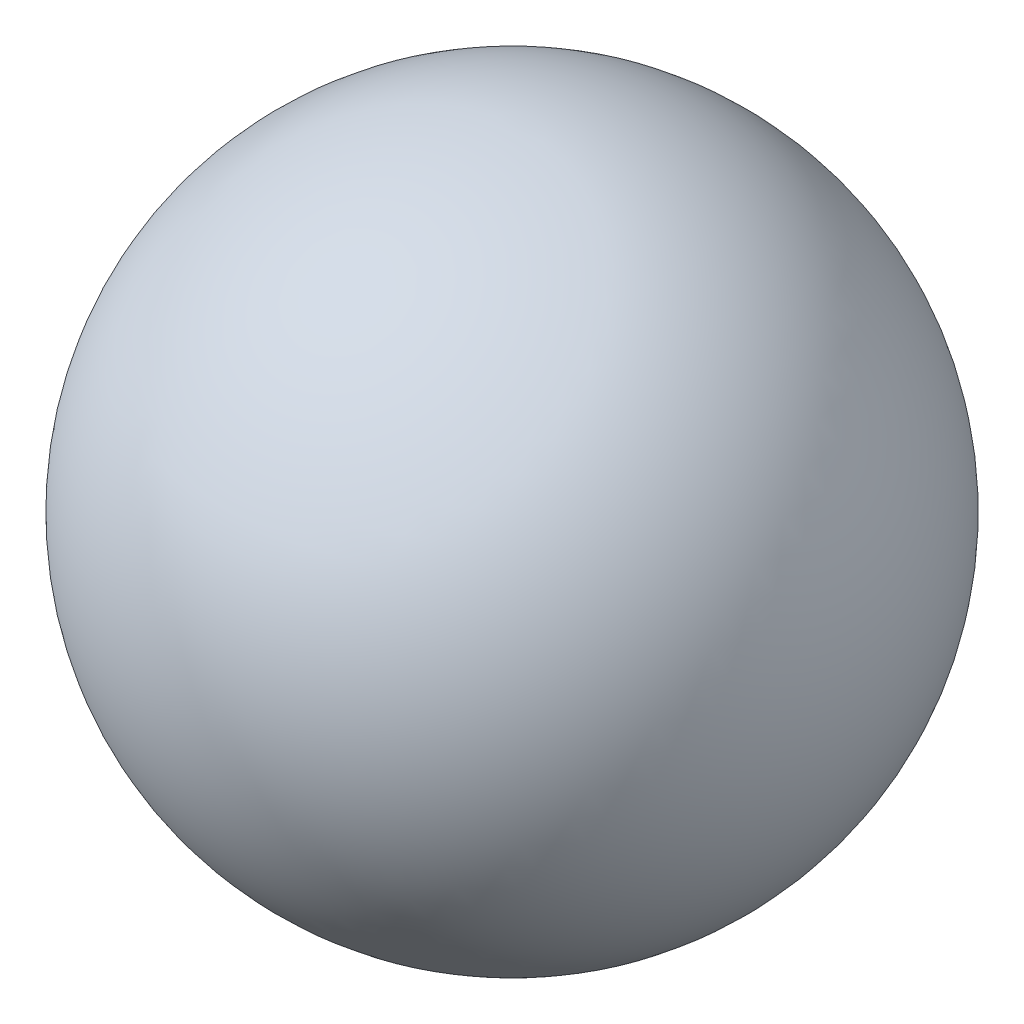
ISO-10303-21;
HEADER;
FILE_DESCRIPTION(('STEP AP214'),'2;1');
FILE_NAME('part.step','',(''),(''),'','','');
FILE_SCHEMA(('AUTOMOTIVE_DESIGN { 1 0 10303 214 1 1 1 1 }'));
ENDSEC;
DATA;
#1=APPLICATION_CONTEXT('core data for automotive mechanical design processes');
#2=APPLICATION_PROTOCOL_DEFINITION('international standard','automotive_design',2000,#1);
#3=PRODUCT_CONTEXT('',#1,'mechanical');
#4=PRODUCT('Part','Part','',(#3));
#5=PRODUCT_RELATED_PRODUCT_CATEGORY('part','',(#4));
#6=PRODUCT_DEFINITION_FORMATION('','',#4);
#7=PRODUCT_DEFINITION_CONTEXT('part definition',#1,'design');
#8=PRODUCT_DEFINITION('design','',#6,#7);
#9=PRODUCT_DEFINITION_SHAPE('','',#8);
#10=(LENGTH_UNIT() NAMED_UNIT(*) SI_UNIT(.MILLI.,.METRE.));
#11=(NAMED_UNIT(*) PLANE_ANGLE_UNIT() SI_UNIT($,.RADIAN.));
#12=(NAMED_UNIT(*) SI_UNIT($,.STERADIAN.) SOLID_ANGLE_UNIT());
#13=UNCERTAINTY_MEASURE_WITH_UNIT(LENGTH_MEASURE(1.E-05),#10,'distance_accuracy_value','');
#14=(GEOMETRIC_REPRESENTATION_CONTEXT(3) GLOBAL_UNCERTAINTY_ASSIGNED_CONTEXT((#13)) GLOBAL_UNIT_ASSIGNED_CONTEXT((#10,
#11,#12)) REPRESENTATION_CONTEXT('',''));
#15=CARTESIAN_POINT('',(0.,0.,0.));
#16=DIRECTION('',(0.,0.,1.));
#17=DIRECTION('',(1.,0.,0.));
#18=AXIS2_PLACEMENT_3D('',#15,#16,#17);
#19=CARTESIAN_POINT('',(0.,0.,0.));
#20=DIRECTION('',(0.,1.,0.));
#21=DIRECTION('',(1.,0.,0.));
#22=AXIS2_PLACEMENT_3D('',#19,#20,#21);
#23=SPHERICAL_SURFACE('',#22,20.75);
#24=CARTESIAN_POINT('',(0.,20.75,0.));
#25=VERTEX_POINT('',#24);
#26=VERTEX_LOOP('',#25);
#27=FACE_BOUND('',#26,.T.);
#28=ADVANCED_FACE('F29',(#27),#23,.T.);
#29=CLOSED_SHELL('',(#28));
#30=MANIFOLD_SOLID_BREP('B2',#29);
#31=ADVANCED_BREP_SHAPE_REPRESENTATION('',(#18,#30),#14);
#32=SHAPE_DEFINITION_REPRESENTATION(#9,#31);
ENDSEC;
END-ISO-10303-21;
